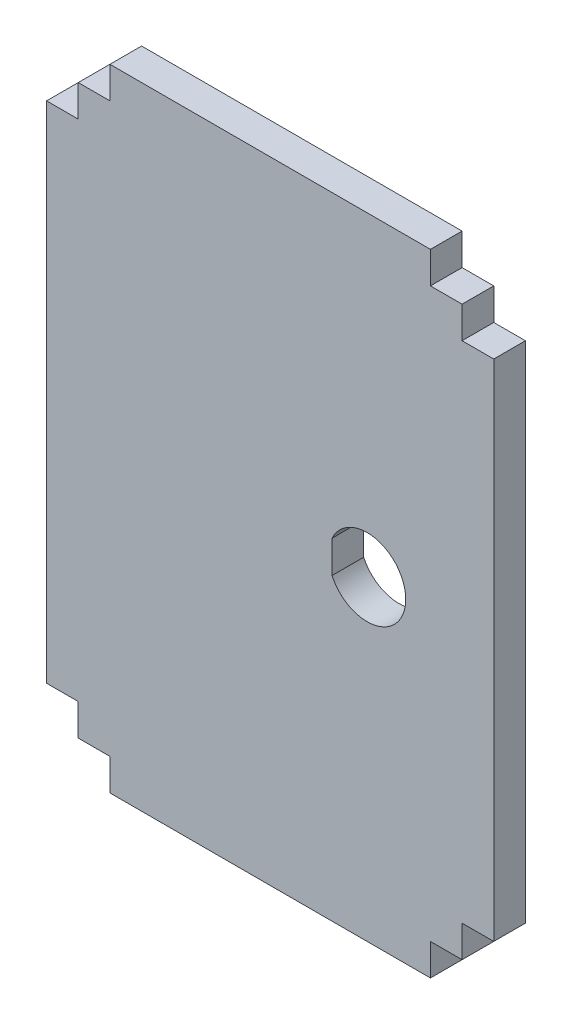
ISO-10303-21;
HEADER;
FILE_DESCRIPTION(('STEP AP214'),'2;1');
FILE_NAME('part.step','',(''),(''),'','','');
FILE_SCHEMA(('AUTOMOTIVE_DESIGN { 1 0 10303 214 1 1 1 1 }'));
ENDSEC;
DATA;
#1=APPLICATION_CONTEXT('core data for automotive mechanical design processes');
#2=APPLICATION_PROTOCOL_DEFINITION('international standard','automotive_design',2000,#1);
#3=PRODUCT_CONTEXT('',#1,'mechanical');
#4=PRODUCT('Part','Part','',(#3));
#5=PRODUCT_RELATED_PRODUCT_CATEGORY('part','',(#4));
#6=PRODUCT_DEFINITION_FORMATION('','',#4);
#7=PRODUCT_DEFINITION_CONTEXT('part definition',#1,'design');
#8=PRODUCT_DEFINITION('design','',#6,#7);
#9=PRODUCT_DEFINITION_SHAPE('','',#8);
#10=(LENGTH_UNIT() NAMED_UNIT(*) SI_UNIT(.MILLI.,.METRE.));
#11=(NAMED_UNIT(*) PLANE_ANGLE_UNIT() SI_UNIT($,.RADIAN.));
#12=(NAMED_UNIT(*) SI_UNIT($,.STERADIAN.) SOLID_ANGLE_UNIT());
#13=UNCERTAINTY_MEASURE_WITH_UNIT(LENGTH_MEASURE(1.E-05),#10,'distance_accuracy_value','');
#14=(GEOMETRIC_REPRESENTATION_CONTEXT(3) GLOBAL_UNCERTAINTY_ASSIGNED_CONTEXT((#13)) GLOBAL_UNIT_ASSIGNED_CONTEXT((#10,
#11,#12)) REPRESENTATION_CONTEXT('',''));
#15=CARTESIAN_POINT('',(0.,0.,0.));
#16=DIRECTION('',(0.,0.,1.));
#17=DIRECTION('',(1.,0.,0.));
#18=AXIS2_PLACEMENT_3D('',#15,#16,#17);
#19=CARTESIAN_POINT('',(-23.8832861119316,-35.1836502917989,-6.35));
#20=DIRECTION('',(-1.,0.,0.));
#21=DIRECTION('',(0.,-1.,0.));
#22=AXIS2_PLACEMENT_3D('',#19,#20,#21);
#23=PLANE('',#22);
#24=DIRECTION('',(0.,-1.,0.));
#25=VECTOR('',#24,1.);
#26=CARTESIAN_POINT('',(-23.8832861119316,-35.1836502917989,0.));
#27=LINE('',#26,#25);
#28=CARTESIAN_POINT('',(-23.8832861119316,-35.1836502917989,0.));
#29=VERTEX_POINT('',#28);
#30=CARTESIAN_POINT('',(-23.8832861119316,-41.5336502917989,0.));
#31=VERTEX_POINT('',#30);
#32=EDGE_CURVE('E198',#29,#31,#27,.T.);
#33=ORIENTED_EDGE('',*,*,#32,.F.);
#34=DIRECTION('',(0.,0.,1.));
#35=VECTOR('',#34,1.);
#36=CARTESIAN_POINT('',(-23.8832861119316,-35.1836502917989,-6.35));
#37=LINE('',#36,#35);
#38=CARTESIAN_POINT('',(-23.8832861119316,-35.1836502917989,-6.35));
#39=VERTEX_POINT('',#38);
#40=EDGE_CURVE('E11',#39,#29,#37,.T.);
#41=ORIENTED_EDGE('',*,*,#40,.F.);
#42=DIRECTION('',(0.,-1.,0.));
#43=VECTOR('',#42,1.);
#44=CARTESIAN_POINT('',(-23.8832861119316,-35.1836502917989,-6.35));
#45=LINE('',#44,#43);
#46=CARTESIAN_POINT('',(-23.8832861119316,-41.5336502917989,-6.35));
#47=VERTEX_POINT('',#46);
#48=EDGE_CURVE('E200',#39,#47,#45,.T.);
#49=ORIENTED_EDGE('',*,*,#48,.T.);
#50=DIRECTION('',(0.,0.,1.));
#51=VECTOR('',#50,1.);
#52=CARTESIAN_POINT('',(-23.8832861119316,-41.5336502917989,-6.35));
#53=LINE('',#52,#51);
#54=EDGE_CURVE('E36',#47,#31,#53,.T.);
#55=ORIENTED_EDGE('',*,*,#54,.T.);
#56=EDGE_LOOP('',(#33,#41,#49,#55));
#57=FACE_BOUND('',#56,.T.);
#58=ADVANCED_FACE('F33',(#57),#23,.T.);
#59=CARTESIAN_POINT('',(-30.2332861119316,-35.1836502917989,-6.35));
#60=DIRECTION('',(0.,-1.,0.));
#61=DIRECTION('',(0.,0.,-1.));
#62=AXIS2_PLACEMENT_3D('',#59,#60,#61);
#63=PLANE('',#62);
#64=DIRECTION('',(1.,0.,0.));
#65=VECTOR('',#64,1.);
#66=CARTESIAN_POINT('',(-30.2332861119316,-35.1836502917989,0.));
#67=LINE('',#66,#65);
#68=CARTESIAN_POINT('',(-30.2332861119316,-35.1836502917989,0.));
#69=VERTEX_POINT('',#68);
#70=EDGE_CURVE('E204',#69,#29,#67,.T.);
#71=ORIENTED_EDGE('',*,*,#70,.F.);
#72=DIRECTION('',(0.,0.,1.));
#73=VECTOR('',#72,1.);
#74=CARTESIAN_POINT('',(-30.2332861119316,-35.1836502917989,-6.35));
#75=LINE('',#74,#73);
#76=CARTESIAN_POINT('',(-30.2332861119316,-35.1836502917989,-6.35));
#77=VERTEX_POINT('',#76);
#78=EDGE_CURVE('E41',#77,#69,#75,.T.);
#79=ORIENTED_EDGE('',*,*,#78,.F.);
#80=DIRECTION('',(1.,0.,0.));
#81=VECTOR('',#80,1.);
#82=CARTESIAN_POINT('',(-30.2332861119316,-35.1836502917989,-6.35));
#83=LINE('',#82,#81);
#84=EDGE_CURVE('E258',#77,#39,#83,.T.);
#85=ORIENTED_EDGE('',*,*,#84,.T.);
#86=ORIENTED_EDGE('',*,*,#40,.T.);
#87=EDGE_LOOP('',(#71,#79,#85,#86));
#88=FACE_BOUND('',#87,.T.);
#89=ADVANCED_FACE('F363',(#88),#63,.T.);
#90=CARTESIAN_POINT('',(-30.2332861119316,-28.8336502917989,-6.35));
#91=DIRECTION('',(-1.,0.,0.));
#92=DIRECTION('',(0.,0.,1.));
#93=AXIS2_PLACEMENT_3D('',#90,#91,#92);
#94=PLANE('',#93);
#95=DIRECTION('',(0.,-1.,0.));
#96=VECTOR('',#95,1.);
#97=CARTESIAN_POINT('',(-30.2332861119316,-28.8336502917989,0.));
#98=LINE('',#97,#96);
#99=CARTESIAN_POINT('',(-30.2332861119316,-28.8336502917989,0.));
#100=VERTEX_POINT('',#99);
#101=EDGE_CURVE('E314',#100,#69,#98,.T.);
#102=ORIENTED_EDGE('',*,*,#101,.F.);
#103=DIRECTION('',(0.,0.,1.));
#104=VECTOR('',#103,1.);
#105=CARTESIAN_POINT('',(-30.2332861119316,-28.8336502917989,-6.35));
#106=LINE('',#105,#104);
#107=CARTESIAN_POINT('',(-30.2332861119316,-28.8336502917989,-6.35));
#108=VERTEX_POINT('',#107);
#109=EDGE_CURVE('E320',#108,#100,#106,.T.);
#110=ORIENTED_EDGE('',*,*,#109,.F.);
#111=DIRECTION('',(0.,-1.,0.));
#112=VECTOR('',#111,1.);
#113=CARTESIAN_POINT('',(-30.2332861119316,-28.8336502917989,-6.35));
#114=LINE('',#113,#112);
#115=EDGE_CURVE('E255',#108,#77,#114,.T.);
#116=ORIENTED_EDGE('',*,*,#115,.T.);
#117=ORIENTED_EDGE('',*,*,#78,.T.);
#118=EDGE_LOOP('',(#102,#110,#116,#117));
#119=FACE_BOUND('',#118,.T.);
#120=ADVANCED_FACE('F432',(#119),#94,.T.);
#121=CARTESIAN_POINT('',(-36.5832861119316,-28.8336502917989,-6.35));
#122=DIRECTION('',(0.,-1.,0.));
#123=DIRECTION('',(0.,0.,-1.));
#124=AXIS2_PLACEMENT_3D('',#121,#122,#123);
#125=PLANE('',#124);
#126=DIRECTION('',(1.,0.,0.));
#127=VECTOR('',#126,1.);
#128=CARTESIAN_POINT('',(-36.5832861119316,-28.8336502917989,0.));
#129=LINE('',#128,#127);
#130=CARTESIAN_POINT('',(-36.5832861119316,-28.8336502917989,0.));
#131=VERTEX_POINT('',#130);
#132=EDGE_CURVE('E311',#131,#100,#129,.T.);
#133=ORIENTED_EDGE('',*,*,#132,.F.);
#134=DIRECTION('',(0.,0.,1.));
#135=VECTOR('',#134,1.);
#136=CARTESIAN_POINT('',(-36.5832861119316,-28.8336502917989,-6.35));
#137=LINE('',#136,#135);
#138=CARTESIAN_POINT('',(-36.5832861119316,-28.8336502917989,-6.35));
#139=VERTEX_POINT('',#138);
#140=EDGE_CURVE('E322',#139,#131,#137,.T.);
#141=ORIENTED_EDGE('',*,*,#140,.F.);
#142=DIRECTION('',(1.,0.,0.));
#143=VECTOR('',#142,1.);
#144=CARTESIAN_POINT('',(-36.5832861119316,-28.8336502917989,-6.35));
#145=LINE('',#144,#143);
#146=EDGE_CURVE('E252',#139,#108,#145,.T.);
#147=ORIENTED_EDGE('',*,*,#146,.T.);
#148=ORIENTED_EDGE('',*,*,#109,.T.);
#149=EDGE_LOOP('',(#133,#141,#147,#148));
#150=FACE_BOUND('',#149,.T.);
#151=ADVANCED_FACE('F430',(#150),#125,.T.);
#152=CARTESIAN_POINT('',(-36.5832861119316,72.3345497082011,-6.35));
#153=DIRECTION('',(-1.,0.,0.));
#154=DIRECTION('',(0.,0.,1.));
#155=AXIS2_PLACEMENT_3D('',#152,#153,#154);
#156=PLANE('',#155);
#157=DIRECTION('',(0.,-1.,0.));
#158=VECTOR('',#157,1.);
#159=CARTESIAN_POINT('',(-36.5832861119316,72.3345497082011,0.));
#160=LINE('',#159,#158);
#161=CARTESIAN_POINT('',(-36.5832861119316,72.3345497082011,0.));
#162=VERTEX_POINT('',#161);
#163=EDGE_CURVE('E308',#162,#131,#160,.T.);
#164=ORIENTED_EDGE('',*,*,#163,.F.);
#165=DIRECTION('',(0.,0.,1.));
#166=VECTOR('',#165,1.);
#167=CARTESIAN_POINT('',(-36.5832861119316,72.3345497082011,-6.35));
#168=LINE('',#167,#166);
#169=CARTESIAN_POINT('',(-36.5832861119316,72.3345497082011,-6.35));
#170=VERTEX_POINT('',#169);
#171=EDGE_CURVE('E324',#170,#162,#168,.T.);
#172=ORIENTED_EDGE('',*,*,#171,.F.);
#173=DIRECTION('',(0.,-1.,0.));
#174=VECTOR('',#173,1.);
#175=CARTESIAN_POINT('',(-36.5832861119316,72.3345497082011,-6.35));
#176=LINE('',#175,#174);
#177=EDGE_CURVE('E249',#170,#139,#176,.T.);
#178=ORIENTED_EDGE('',*,*,#177,.T.);
#179=ORIENTED_EDGE('',*,*,#140,.T.);
#180=EDGE_LOOP('',(#164,#172,#178,#179));
#181=FACE_BOUND('',#180,.T.);
#182=ADVANCED_FACE('F426',(#181),#156,.T.);
#183=CARTESIAN_POINT('',(-30.2332861119316,72.3345497082011,-6.35));
#184=DIRECTION('',(0.,1.,0.));
#185=DIRECTION('',(0.,0.,1.));
#186=AXIS2_PLACEMENT_3D('',#183,#184,#185);
#187=PLANE('',#186);
#188=DIRECTION('',(-1.,0.,0.));
#189=VECTOR('',#188,1.);
#190=CARTESIAN_POINT('',(-30.2332861119316,72.3345497082011,0.));
#191=LINE('',#190,#189);
#192=CARTESIAN_POINT('',(-30.2332861119316,72.3345497082011,0.));
#193=VERTEX_POINT('',#192);
#194=EDGE_CURVE('E305',#193,#162,#191,.T.);
#195=ORIENTED_EDGE('',*,*,#194,.F.);
#196=DIRECTION('',(0.,0.,1.));
#197=VECTOR('',#196,1.);
#198=CARTESIAN_POINT('',(-30.2332861119316,72.3345497082011,-6.35));
#199=LINE('',#198,#197);
#200=CARTESIAN_POINT('',(-30.2332861119316,72.3345497082011,-6.35));
#201=VERTEX_POINT('',#200);
#202=EDGE_CURVE('E326',#201,#193,#199,.T.);
#203=ORIENTED_EDGE('',*,*,#202,.F.);
#204=DIRECTION('',(-1.,0.,0.));
#205=VECTOR('',#204,1.);
#206=CARTESIAN_POINT('',(-30.2332861119316,72.3345497082011,-6.35));
#207=LINE('',#206,#205);
#208=EDGE_CURVE('E246',#201,#170,#207,.T.);
#209=ORIENTED_EDGE('',*,*,#208,.T.);
#210=ORIENTED_EDGE('',*,*,#171,.T.);
#211=EDGE_LOOP('',(#195,#203,#209,#210));
#212=FACE_BOUND('',#211,.T.);
#213=ADVANCED_FACE('F422',(#212),#187,.T.);
#214=CARTESIAN_POINT('',(-30.2332861119316,78.6845497082011,-6.35));
#215=DIRECTION('',(-1.,0.,0.));
#216=DIRECTION('',(0.,0.,1.));
#217=AXIS2_PLACEMENT_3D('',#214,#215,#216);
#218=PLANE('',#217);
#219=DIRECTION('',(0.,-1.,0.));
#220=VECTOR('',#219,1.);
#221=CARTESIAN_POINT('',(-30.2332861119316,78.6845497082011,0.));
#222=LINE('',#221,#220);
#223=CARTESIAN_POINT('',(-30.2332861119316,78.6845497082011,0.));
#224=VERTEX_POINT('',#223);
#225=EDGE_CURVE('E302',#224,#193,#222,.T.);
#226=ORIENTED_EDGE('',*,*,#225,.F.);
#227=DIRECTION('',(0.,0.,1.));
#228=VECTOR('',#227,1.);
#229=CARTESIAN_POINT('',(-30.2332861119316,78.6845497082011,-6.35));
#230=LINE('',#229,#228);
#231=CARTESIAN_POINT('',(-30.2332861119316,78.6845497082011,-6.35));
#232=VERTEX_POINT('',#231);
#233=EDGE_CURVE('E328',#232,#224,#230,.T.);
#234=ORIENTED_EDGE('',*,*,#233,.F.);
#235=DIRECTION('',(0.,-1.,0.));
#236=VECTOR('',#235,1.);
#237=CARTESIAN_POINT('',(-30.2332861119316,78.6845497082011,-6.35));
#238=LINE('',#237,#236);
#239=EDGE_CURVE('E243',#232,#201,#238,.T.);
#240=ORIENTED_EDGE('',*,*,#239,.T.);
#241=ORIENTED_EDGE('',*,*,#202,.T.);
#242=EDGE_LOOP('',(#226,#234,#240,#241));
#243=FACE_BOUND('',#242,.T.);
#244=ADVANCED_FACE('F418',(#243),#218,.T.);
#245=CARTESIAN_POINT('',(-23.8832861119316,78.6845497082011,-6.35));
#246=DIRECTION('',(0.,1.,0.));
#247=DIRECTION('',(-1.,0.,0.));
#248=AXIS2_PLACEMENT_3D('',#245,#246,#247);
#249=PLANE('',#248);
#250=DIRECTION('',(-1.,0.,0.));
#251=VECTOR('',#250,1.);
#252=CARTESIAN_POINT('',(-23.8832861119316,78.6845497082011,0.));
#253=LINE('',#252,#251);
#254=CARTESIAN_POINT('',(-23.8832861119316,78.6845497082011,0.));
#255=VERTEX_POINT('',#254);
#256=EDGE_CURVE('E299',#255,#224,#253,.T.);
#257=ORIENTED_EDGE('',*,*,#256,.F.);
#258=DIRECTION('',(0.,0.,1.));
#259=VECTOR('',#258,1.);
#260=CARTESIAN_POINT('',(-23.8832861119316,78.6845497082011,-6.35));
#261=LINE('',#260,#259);
#262=CARTESIAN_POINT('',(-23.8832861119316,78.6845497082011,-6.35));
#263=VERTEX_POINT('',#262);
#264=EDGE_CURVE('E330',#263,#255,#261,.T.);
#265=ORIENTED_EDGE('',*,*,#264,.F.);
#266=DIRECTION('',(-1.,0.,0.));
#267=VECTOR('',#266,1.);
#268=CARTESIAN_POINT('',(-23.8832861119316,78.6845497082011,-6.35));
#269=LINE('',#268,#267);
#270=EDGE_CURVE('E240',#263,#232,#269,.T.);
#271=ORIENTED_EDGE('',*,*,#270,.T.);
#272=ORIENTED_EDGE('',*,*,#233,.T.);
#273=EDGE_LOOP('',(#257,#265,#271,#272));
#274=FACE_BOUND('',#273,.T.);
#275=ADVANCED_FACE('F414',(#274),#249,.T.);
#276=CARTESIAN_POINT('',(-23.8832861119316,85.0345497082011,-6.35));
#277=DIRECTION('',(-1.,0.,0.));
#278=DIRECTION('',(0.,-1.,0.));
#279=AXIS2_PLACEMENT_3D('',#276,#277,#278);
#280=PLANE('',#279);
#281=DIRECTION('',(0.,-1.,0.));
#282=VECTOR('',#281,1.);
#283=CARTESIAN_POINT('',(-23.8832861119316,85.0345497082011,0.));
#284=LINE('',#283,#282);
#285=CARTESIAN_POINT('',(-23.8832861119316,85.0345497082011,0.));
#286=VERTEX_POINT('',#285);
#287=EDGE_CURVE('E296',#286,#255,#284,.T.);
#288=ORIENTED_EDGE('',*,*,#287,.F.);
#289=DIRECTION('',(0.,0.,1.));
#290=VECTOR('',#289,1.);
#291=CARTESIAN_POINT('',(-23.8832861119316,85.0345497082011,-6.35));
#292=LINE('',#291,#290);
#293=CARTESIAN_POINT('',(-23.8832861119316,85.0345497082011,-6.35));
#294=VERTEX_POINT('',#293);
#295=EDGE_CURVE('E332',#294,#286,#292,.T.);
#296=ORIENTED_EDGE('',*,*,#295,.F.);
#297=DIRECTION('',(0.,-1.,0.));
#298=VECTOR('',#297,1.);
#299=CARTESIAN_POINT('',(-23.8832861119316,85.0345497082011,-6.35));
#300=LINE('',#299,#298);
#301=EDGE_CURVE('E237',#294,#263,#300,.T.);
#302=ORIENTED_EDGE('',*,*,#301,.T.);
#303=ORIENTED_EDGE('',*,*,#264,.T.);
#304=EDGE_LOOP('',(#288,#296,#302,#303));
#305=FACE_BOUND('',#304,.T.);
#306=ADVANCED_FACE('F410',(#305),#280,.T.);
#307=CARTESIAN_POINT('',(40.4041138880684,85.0345497082011,-6.35));
#308=DIRECTION('',(0.,1.,0.));
#309=DIRECTION('',(-1.,0.,0.));
#310=AXIS2_PLACEMENT_3D('',#307,#308,#309);
#311=PLANE('',#310);
#312=DIRECTION('',(-1.,0.,0.));
#313=VECTOR('',#312,1.);
#314=CARTESIAN_POINT('',(40.4041138880684,85.0345497082011,0.));
#315=LINE('',#314,#313);
#316=CARTESIAN_POINT('',(40.4041138880684,85.0345497082011,0.));
#317=VERTEX_POINT('',#316);
#318=EDGE_CURVE('E293',#317,#286,#315,.T.);
#319=ORIENTED_EDGE('',*,*,#318,.F.);
#320=DIRECTION('',(0.,0.,1.));
#321=VECTOR('',#320,1.);
#322=CARTESIAN_POINT('',(40.4041138880684,85.0345497082011,-6.35));
#323=LINE('',#322,#321);
#324=CARTESIAN_POINT('',(40.4041138880684,85.0345497082011,-6.35));
#325=VERTEX_POINT('',#324);
#326=EDGE_CURVE('E334',#325,#317,#323,.T.);
#327=ORIENTED_EDGE('',*,*,#326,.F.);
#328=DIRECTION('',(-1.,0.,0.));
#329=VECTOR('',#328,1.);
#330=CARTESIAN_POINT('',(40.4041138880684,85.0345497082011,-6.35));
#331=LINE('',#330,#329);
#332=EDGE_CURVE('E234',#325,#294,#331,.T.);
#333=ORIENTED_EDGE('',*,*,#332,.T.);
#334=ORIENTED_EDGE('',*,*,#295,.T.);
#335=EDGE_LOOP('',(#319,#327,#333,#334));
#336=FACE_BOUND('',#335,.T.);
#337=ADVANCED_FACE('F406',(#336),#311,.T.);
#338=CARTESIAN_POINT('',(40.4041138880684,78.6845497082011,-6.35));
#339=DIRECTION('',(1.,0.,0.));
#340=DIRECTION('',(0.,0.,-1.));
#341=AXIS2_PLACEMENT_3D('',#338,#339,#340);
#342=PLANE('',#341);
#343=DIRECTION('',(0.,1.,0.));
#344=VECTOR('',#343,1.);
#345=CARTESIAN_POINT('',(40.4041138880684,78.6845497082011,0.));
#346=LINE('',#345,#344);
#347=CARTESIAN_POINT('',(40.4041138880684,78.6845497082011,0.));
#348=VERTEX_POINT('',#347);
#349=EDGE_CURVE('E290',#348,#317,#346,.T.);
#350=ORIENTED_EDGE('',*,*,#349,.F.);
#351=DIRECTION('',(0.,0.,1.));
#352=VECTOR('',#351,1.);
#353=CARTESIAN_POINT('',(40.4041138880684,78.6845497082011,-6.35));
#354=LINE('',#353,#352);
#355=CARTESIAN_POINT('',(40.4041138880684,78.6845497082011,-6.35));
#356=VERTEX_POINT('',#355);
#357=EDGE_CURVE('E336',#356,#348,#354,.T.);
#358=ORIENTED_EDGE('',*,*,#357,.F.);
#359=DIRECTION('',(0.,1.,0.));
#360=VECTOR('',#359,1.);
#361=CARTESIAN_POINT('',(40.4041138880684,78.6845497082011,-6.35));
#362=LINE('',#361,#360);
#363=EDGE_CURVE('E231',#356,#325,#362,.T.);
#364=ORIENTED_EDGE('',*,*,#363,.T.);
#365=ORIENTED_EDGE('',*,*,#326,.T.);
#366=EDGE_LOOP('',(#350,#358,#364,#365));
#367=FACE_BOUND('',#366,.T.);
#368=ADVANCED_FACE('F402',(#367),#342,.T.);
#369=CARTESIAN_POINT('',(46.7541138880684,78.6845497082011,-6.35));
#370=DIRECTION('',(0.,1.,0.));
#371=DIRECTION('',(0.,0.,1.));
#372=AXIS2_PLACEMENT_3D('',#369,#370,#371);
#373=PLANE('',#372);
#374=DIRECTION('',(-1.,0.,0.));
#375=VECTOR('',#374,1.);
#376=CARTESIAN_POINT('',(46.7541138880684,78.6845497082011,0.));
#377=LINE('',#376,#375);
#378=CARTESIAN_POINT('',(46.7541138880684,78.6845497082011,0.));
#379=VERTEX_POINT('',#378);
#380=EDGE_CURVE('E287',#379,#348,#377,.T.);
#381=ORIENTED_EDGE('',*,*,#380,.F.);
#382=DIRECTION('',(0.,0.,1.));
#383=VECTOR('',#382,1.);
#384=CARTESIAN_POINT('',(46.7541138880684,78.6845497082011,-6.35));
#385=LINE('',#384,#383);
#386=CARTESIAN_POINT('',(46.7541138880684,78.6845497082011,-6.35));
#387=VERTEX_POINT('',#386);
#388=EDGE_CURVE('E338',#387,#379,#385,.T.);
#389=ORIENTED_EDGE('',*,*,#388,.F.);
#390=DIRECTION('',(-1.,0.,0.));
#391=VECTOR('',#390,1.);
#392=CARTESIAN_POINT('',(46.7541138880684,78.6845497082011,-6.35));
#393=LINE('',#392,#391);
#394=EDGE_CURVE('E228',#387,#356,#393,.T.);
#395=ORIENTED_EDGE('',*,*,#394,.T.);
#396=ORIENTED_EDGE('',*,*,#357,.T.);
#397=EDGE_LOOP('',(#381,#389,#395,#396));
#398=FACE_BOUND('',#397,.T.);
#399=ADVANCED_FACE('F398',(#398),#373,.T.);
#400=CARTESIAN_POINT('',(46.7541138880684,72.3345497082011,-6.35));
#401=DIRECTION('',(1.,0.,0.));
#402=DIRECTION('',(0.,0.,-1.));
#403=AXIS2_PLACEMENT_3D('',#400,#401,#402);
#404=PLANE('',#403);
#405=DIRECTION('',(0.,1.,0.));
#406=VECTOR('',#405,1.);
#407=CARTESIAN_POINT('',(46.7541138880684,72.3345497082011,0.));
#408=LINE('',#407,#406);
#409=CARTESIAN_POINT('',(46.7541138880684,72.3345497082011,0.));
#410=VERTEX_POINT('',#409);
#411=EDGE_CURVE('E284',#410,#379,#408,.T.);
#412=ORIENTED_EDGE('',*,*,#411,.F.);
#413=DIRECTION('',(0.,0.,1.));
#414=VECTOR('',#413,1.);
#415=CARTESIAN_POINT('',(46.7541138880684,72.3345497082011,-6.35));
#416=LINE('',#415,#414);
#417=CARTESIAN_POINT('',(46.7541138880684,72.3345497082011,-6.35));
#418=VERTEX_POINT('',#417);
#419=EDGE_CURVE('E340',#418,#410,#416,.T.);
#420=ORIENTED_EDGE('',*,*,#419,.F.);
#421=DIRECTION('',(0.,1.,0.));
#422=VECTOR('',#421,1.);
#423=CARTESIAN_POINT('',(46.7541138880684,72.3345497082011,-6.35));
#424=LINE('',#423,#422);
#425=EDGE_CURVE('E225',#418,#387,#424,.T.);
#426=ORIENTED_EDGE('',*,*,#425,.T.);
#427=ORIENTED_EDGE('',*,*,#388,.T.);
#428=EDGE_LOOP('',(#412,#420,#426,#427));
#429=FACE_BOUND('',#428,.T.);
#430=ADVANCED_FACE('F394',(#429),#404,.T.);
#431=CARTESIAN_POINT('',(53.1041138880684,72.3345497082011,-6.35));
#432=DIRECTION('',(0.,1.,0.));
#433=DIRECTION('',(-1.,0.,0.));
#434=AXIS2_PLACEMENT_3D('',#431,#432,#433);
#435=PLANE('',#434);
#436=DIRECTION('',(-1.,0.,0.));
#437=VECTOR('',#436,1.);
#438=CARTESIAN_POINT('',(53.1041138880684,72.3345497082011,0.));
#439=LINE('',#438,#437);
#440=CARTESIAN_POINT('',(53.1041138880684,72.3345497082011,0.));
#441=VERTEX_POINT('',#440);
#442=EDGE_CURVE('E281',#441,#410,#439,.T.);
#443=ORIENTED_EDGE('',*,*,#442,.F.);
#444=DIRECTION('',(0.,0.,1.));
#445=VECTOR('',#444,1.);
#446=CARTESIAN_POINT('',(53.1041138880684,72.3345497082011,-6.35));
#447=LINE('',#446,#445);
#448=CARTESIAN_POINT('',(53.1041138880684,72.3345497082011,-6.35));
#449=VERTEX_POINT('',#448);
#450=EDGE_CURVE('E342',#449,#441,#447,.T.);
#451=ORIENTED_EDGE('',*,*,#450,.F.);
#452=DIRECTION('',(-1.,0.,0.));
#453=VECTOR('',#452,1.);
#454=CARTESIAN_POINT('',(53.1041138880684,72.3345497082011,-6.35));
#455=LINE('',#454,#453);
#456=EDGE_CURVE('E222',#449,#418,#455,.T.);
#457=ORIENTED_EDGE('',*,*,#456,.T.);
#458=ORIENTED_EDGE('',*,*,#419,.T.);
#459=EDGE_LOOP('',(#443,#451,#457,#458));
#460=FACE_BOUND('',#459,.T.);
#461=ADVANCED_FACE('F390',(#460),#435,.T.);
#462=CARTESIAN_POINT('',(53.1041138880684,-28.8336502917988,-6.35));
#463=DIRECTION('',(1.,0.,0.));
#464=DIRECTION('',(0.,0.,-1.));
#465=AXIS2_PLACEMENT_3D('',#462,#463,#464);
#466=PLANE('',#465);
#467=DIRECTION('',(0.,1.,0.));
#468=VECTOR('',#467,1.);
#469=CARTESIAN_POINT('',(53.1041138880684,-28.8336502917988,0.));
#470=LINE('',#469,#468);
#471=CARTESIAN_POINT('',(53.1041138880684,-28.8336502917988,0.));
#472=VERTEX_POINT('',#471);
#473=EDGE_CURVE('E278',#472,#441,#470,.T.);
#474=ORIENTED_EDGE('',*,*,#473,.F.);
#475=DIRECTION('',(0.,0.,1.));
#476=VECTOR('',#475,1.);
#477=CARTESIAN_POINT('',(53.1041138880684,-28.8336502917988,-6.35));
#478=LINE('',#477,#476);
#479=CARTESIAN_POINT('',(53.1041138880684,-28.8336502917988,-6.35));
#480=VERTEX_POINT('',#479);
#481=EDGE_CURVE('E344',#480,#472,#478,.T.);
#482=ORIENTED_EDGE('',*,*,#481,.F.);
#483=DIRECTION('',(0.,1.,0.));
#484=VECTOR('',#483,1.);
#485=CARTESIAN_POINT('',(53.1041138880684,-28.8336502917988,-6.35));
#486=LINE('',#485,#484);
#487=EDGE_CURVE('E219',#480,#449,#486,.T.);
#488=ORIENTED_EDGE('',*,*,#487,.T.);
#489=ORIENTED_EDGE('',*,*,#450,.T.);
#490=EDGE_LOOP('',(#474,#482,#488,#489));
#491=FACE_BOUND('',#490,.T.);
#492=ADVANCED_FACE('F386',(#491),#466,.T.);
#493=CARTESIAN_POINT('',(46.7541138880684,-28.8336502917988,-6.35));
#494=DIRECTION('',(0.,-1.,0.));
#495=DIRECTION('',(1.,0.,0.));
#496=AXIS2_PLACEMENT_3D('',#493,#494,#495);
#497=PLANE('',#496);
#498=DIRECTION('',(1.,0.,0.));
#499=VECTOR('',#498,1.);
#500=CARTESIAN_POINT('',(46.7541138880684,-28.8336502917988,0.));
#501=LINE('',#500,#499);
#502=CARTESIAN_POINT('',(46.7541138880684,-28.8336502917988,0.));
#503=VERTEX_POINT('',#502);
#504=EDGE_CURVE('E275',#503,#472,#501,.T.);
#505=ORIENTED_EDGE('',*,*,#504,.F.);
#506=DIRECTION('',(0.,0.,1.));
#507=VECTOR('',#506,1.);
#508=CARTESIAN_POINT('',(46.7541138880684,-28.8336502917988,-6.35));
#509=LINE('',#508,#507);
#510=CARTESIAN_POINT('',(46.7541138880684,-28.8336502917988,-6.35));
#511=VERTEX_POINT('',#510);
#512=EDGE_CURVE('E346',#511,#503,#509,.T.);
#513=ORIENTED_EDGE('',*,*,#512,.F.);
#514=DIRECTION('',(1.,0.,0.));
#515=VECTOR('',#514,1.);
#516=CARTESIAN_POINT('',(46.7541138880684,-28.8336502917988,-6.35));
#517=LINE('',#516,#515);
#518=EDGE_CURVE('E216',#511,#480,#517,.T.);
#519=ORIENTED_EDGE('',*,*,#518,.T.);
#520=ORIENTED_EDGE('',*,*,#481,.T.);
#521=EDGE_LOOP('',(#505,#513,#519,#520));
#522=FACE_BOUND('',#521,.T.);
#523=ADVANCED_FACE('F382',(#522),#497,.T.);
#524=CARTESIAN_POINT('',(46.7541138880684,-35.1836502917989,-6.35));
#525=DIRECTION('',(1.,0.,0.));
#526=DIRECTION('',(0.,0.,-1.));
#527=AXIS2_PLACEMENT_3D('',#524,#525,#526);
#528=PLANE('',#527);
#529=DIRECTION('',(0.,1.,0.));
#530=VECTOR('',#529,1.);
#531=CARTESIAN_POINT('',(46.7541138880684,-35.1836502917989,0.));
#532=LINE('',#531,#530);
#533=CARTESIAN_POINT('',(46.7541138880684,-35.1836502917989,0.));
#534=VERTEX_POINT('',#533);
#535=EDGE_CURVE('E272',#534,#503,#532,.T.);
#536=ORIENTED_EDGE('',*,*,#535,.F.);
#537=DIRECTION('',(0.,0.,1.));
#538=VECTOR('',#537,1.);
#539=CARTESIAN_POINT('',(46.7541138880684,-35.1836502917989,-6.35));
#540=LINE('',#539,#538);
#541=CARTESIAN_POINT('',(46.7541138880684,-35.1836502917989,-6.35));
#542=VERTEX_POINT('',#541);
#543=EDGE_CURVE('E348',#542,#534,#540,.T.);
#544=ORIENTED_EDGE('',*,*,#543,.F.);
#545=DIRECTION('',(0.,1.,0.));
#546=VECTOR('',#545,1.);
#547=CARTESIAN_POINT('',(46.7541138880684,-35.1836502917989,-6.35));
#548=LINE('',#547,#546);
#549=EDGE_CURVE('E213',#542,#511,#548,.T.);
#550=ORIENTED_EDGE('',*,*,#549,.T.);
#551=ORIENTED_EDGE('',*,*,#512,.T.);
#552=EDGE_LOOP('',(#536,#544,#550,#551));
#553=FACE_BOUND('',#552,.T.);
#554=ADVANCED_FACE('F378',(#553),#528,.T.);
#555=CARTESIAN_POINT('',(40.4041138880684,-35.1836502917989,-6.35));
#556=DIRECTION('',(0.,-1.,0.));
#557=DIRECTION('',(0.,0.,-1.));
#558=AXIS2_PLACEMENT_3D('',#555,#556,#557);
#559=PLANE('',#558);
#560=DIRECTION('',(1.,0.,0.));
#561=VECTOR('',#560,1.);
#562=CARTESIAN_POINT('',(40.4041138880684,-35.1836502917989,0.));
#563=LINE('',#562,#561);
#564=CARTESIAN_POINT('',(40.4041138880684,-35.1836502917989,0.));
#565=VERTEX_POINT('',#564);
#566=EDGE_CURVE('E269',#565,#534,#563,.T.);
#567=ORIENTED_EDGE('',*,*,#566,.F.);
#568=DIRECTION('',(0.,0.,1.));
#569=VECTOR('',#568,1.);
#570=CARTESIAN_POINT('',(40.4041138880684,-35.1836502917989,-6.35));
#571=LINE('',#570,#569);
#572=CARTESIAN_POINT('',(40.4041138880684,-35.1836502917989,-6.35));
#573=VERTEX_POINT('',#572);
#574=EDGE_CURVE('E350',#573,#565,#571,.T.);
#575=ORIENTED_EDGE('',*,*,#574,.F.);
#576=DIRECTION('',(1.,0.,0.));
#577=VECTOR('',#576,1.);
#578=CARTESIAN_POINT('',(40.4041138880684,-35.1836502917989,-6.35));
#579=LINE('',#578,#577);
#580=EDGE_CURVE('E210',#573,#542,#579,.T.);
#581=ORIENTED_EDGE('',*,*,#580,.T.);
#582=ORIENTED_EDGE('',*,*,#543,.T.);
#583=EDGE_LOOP('',(#567,#575,#581,#582));
#584=FACE_BOUND('',#583,.T.);
#585=ADVANCED_FACE('F376',(#584),#559,.T.);
#586=CARTESIAN_POINT('',(40.4041138880684,-41.5336502917989,-6.35));
#587=DIRECTION('',(1.,0.,0.));
#588=DIRECTION('',(0.,0.,-1.));
#589=AXIS2_PLACEMENT_3D('',#586,#587,#588);
#590=PLANE('',#589);
#591=DIRECTION('',(0.,1.,0.));
#592=VECTOR('',#591,1.);
#593=CARTESIAN_POINT('',(40.4041138880684,-41.5336502917989,0.));
#594=LINE('',#593,#592);
#595=CARTESIAN_POINT('',(40.4041138880684,-41.5336502917989,0.));
#596=VERTEX_POINT('',#595);
#597=EDGE_CURVE('E266',#596,#565,#594,.T.);
#598=ORIENTED_EDGE('',*,*,#597,.F.);
#599=DIRECTION('',(0.,0.,1.));
#600=VECTOR('',#599,1.);
#601=CARTESIAN_POINT('',(40.4041138880684,-41.5336502917989,-6.35));
#602=LINE('',#601,#600);
#603=CARTESIAN_POINT('',(40.4041138880684,-41.5336502917989,-6.35));
#604=VERTEX_POINT('',#603);
#605=EDGE_CURVE('E351',#604,#596,#602,.T.);
#606=ORIENTED_EDGE('',*,*,#605,.F.);
#607=DIRECTION('',(0.,1.,0.));
#608=VECTOR('',#607,1.);
#609=CARTESIAN_POINT('',(40.4041138880684,-41.5336502917989,-6.35));
#610=LINE('',#609,#608);
#611=EDGE_CURVE('E207',#604,#573,#610,.T.);
#612=ORIENTED_EDGE('',*,*,#611,.T.);
#613=ORIENTED_EDGE('',*,*,#574,.T.);
#614=EDGE_LOOP('',(#598,#606,#612,#613));
#615=FACE_BOUND('',#614,.T.);
#616=ADVANCED_FACE('F372',(#615),#590,.T.);
#617=CARTESIAN_POINT('',(-23.8832861119316,-41.5336502917989,-6.35));
#618=DIRECTION('',(0.,-1.,0.));
#619=DIRECTION('',(1.,0.,0.));
#620=AXIS2_PLACEMENT_3D('',#617,#618,#619);
#621=PLANE('',#620);
#622=DIRECTION('',(1.,0.,0.));
#623=VECTOR('',#622,1.);
#624=CARTESIAN_POINT('',(-23.8832861119316,-41.5336502917989,0.));
#625=LINE('',#624,#623);
#626=EDGE_CURVE('E263',#31,#596,#625,.T.);
#627=ORIENTED_EDGE('',*,*,#626,.F.);
#628=ORIENTED_EDGE('',*,*,#54,.F.);
#629=DIRECTION('',(1.,0.,0.));
#630=VECTOR('',#629,1.);
#631=CARTESIAN_POINT('',(-23.8832861119316,-41.5336502917989,-6.35));
#632=LINE('',#631,#630);
#633=EDGE_CURVE('E203',#47,#604,#632,.T.);
#634=ORIENTED_EDGE('',*,*,#633,.T.);
#635=ORIENTED_EDGE('',*,*,#605,.T.);
#636=EDGE_LOOP('',(#627,#628,#634,#635));
#637=FACE_BOUND('',#636,.T.);
#638=ADVANCED_FACE('F359',(#637),#621,.T.);
#639=CARTESIAN_POINT('',(0.,0.,-6.35));
#640=DIRECTION('',(0.,0.,1.));
#641=DIRECTION('',(1.,0.,0.));
#642=AXIS2_PLACEMENT_3D('',#639,#640,#641);
#643=PLANE('',#642);
#644=DIRECTION('',(0.,1.,0.));
#645=VECTOR('',#644,1.);
#646=CARTESIAN_POINT('',(20.6683138625752,24.9929066472011,-6.35));
#647=LINE('',#646,#645);
#648=CARTESIAN_POINT('',(20.6683138625752,18.5079927692011,-6.35));
#649=VERTEX_POINT('',#648);
#650=CARTESIAN_POINT('',(20.6683138625752,24.9929066472011,-6.35));
#651=VERTEX_POINT('',#650);
#652=EDGE_CURVE('E193',#649,#651,#647,.T.);
#653=ORIENTED_EDGE('',*,*,#652,.F.);
#654=CARTESIAN_POINT('',(27.7041138880684,21.7504497082011,-6.35));
#655=DIRECTION('',(0.,0.,-1.));
#656=DIRECTION('',(-1.,0.,0.));
#657=AXIS2_PLACEMENT_3D('',#654,#655,#656);
#658=CIRCLE('',#657,7.747);
#659=EDGE_CURVE('E49',#651,#649,#658,.T.);
#660=ORIENTED_EDGE('',*,*,#659,.F.);
#661=EDGE_LOOP('',(#653,#660));
#662=FACE_BOUND('',#661,.T.);
#663=ORIENTED_EDGE('',*,*,#48,.F.);
#664=ORIENTED_EDGE('',*,*,#84,.F.);
#665=ORIENTED_EDGE('',*,*,#115,.F.);
#666=ORIENTED_EDGE('',*,*,#146,.F.);
#667=ORIENTED_EDGE('',*,*,#177,.F.);
#668=ORIENTED_EDGE('',*,*,#208,.F.);
#669=ORIENTED_EDGE('',*,*,#239,.F.);
#670=ORIENTED_EDGE('',*,*,#270,.F.);
#671=ORIENTED_EDGE('',*,*,#301,.F.);
#672=ORIENTED_EDGE('',*,*,#332,.F.);
#673=ORIENTED_EDGE('',*,*,#363,.F.);
#674=ORIENTED_EDGE('',*,*,#394,.F.);
#675=ORIENTED_EDGE('',*,*,#425,.F.);
#676=ORIENTED_EDGE('',*,*,#456,.F.);
#677=ORIENTED_EDGE('',*,*,#487,.F.);
#678=ORIENTED_EDGE('',*,*,#518,.F.);
#679=ORIENTED_EDGE('',*,*,#549,.F.);
#680=ORIENTED_EDGE('',*,*,#580,.F.);
#681=ORIENTED_EDGE('',*,*,#611,.F.);
#682=ORIENTED_EDGE('',*,*,#633,.F.);
#683=EDGE_LOOP('',(#663,#664,#665,#666,#667,#668,#669,#670,#671,#672,#673,#674,#675,#676,#677,
#678,#679,#680,#681,#682));
#684=FACE_BOUND('',#683,.T.);
#685=ADVANCED_FACE('F366',(#662,#684),#643,.F.);
#686=CARTESIAN_POINT('',(0.,0.,0.));
#687=DIRECTION('',(0.,0.,1.));
#688=DIRECTION('',(1.,0.,0.));
#689=AXIS2_PLACEMENT_3D('',#686,#687,#688);
#690=PLANE('',#689);
#691=CARTESIAN_POINT('',(27.7041138880684,21.7504497082011,0.));
#692=DIRECTION('',(0.,0.,-1.));
#693=DIRECTION('',(-1.,0.,0.));
#694=AXIS2_PLACEMENT_3D('',#691,#692,#693);
#695=CIRCLE('',#694,7.747);
#696=CARTESIAN_POINT('',(20.6683138625752,24.9929066472011,0.));
#697=VERTEX_POINT('',#696);
#698=CARTESIAN_POINT('',(20.6683138625752,18.5079927692011,0.));
#699=VERTEX_POINT('',#698);
#700=EDGE_CURVE('E54',#697,#699,#695,.T.);
#701=ORIENTED_EDGE('',*,*,#700,.T.);
#702=DIRECTION('',(0.,1.,0.));
#703=VECTOR('',#702,1.);
#704=CARTESIAN_POINT('',(20.6683138625752,24.9929066472011,0.));
#705=LINE('',#704,#703);
#706=EDGE_CURVE('E185',#699,#697,#705,.T.);
#707=ORIENTED_EDGE('',*,*,#706,.T.);
#708=EDGE_LOOP('',(#701,#707));
#709=FACE_BOUND('',#708,.T.);
#710=ORIENTED_EDGE('',*,*,#32,.T.);
#711=ORIENTED_EDGE('',*,*,#626,.T.);
#712=ORIENTED_EDGE('',*,*,#597,.T.);
#713=ORIENTED_EDGE('',*,*,#566,.T.);
#714=ORIENTED_EDGE('',*,*,#535,.T.);
#715=ORIENTED_EDGE('',*,*,#504,.T.);
#716=ORIENTED_EDGE('',*,*,#473,.T.);
#717=ORIENTED_EDGE('',*,*,#442,.T.);
#718=ORIENTED_EDGE('',*,*,#411,.T.);
#719=ORIENTED_EDGE('',*,*,#380,.T.);
#720=ORIENTED_EDGE('',*,*,#349,.T.);
#721=ORIENTED_EDGE('',*,*,#318,.T.);
#722=ORIENTED_EDGE('',*,*,#287,.T.);
#723=ORIENTED_EDGE('',*,*,#256,.T.);
#724=ORIENTED_EDGE('',*,*,#225,.T.);
#725=ORIENTED_EDGE('',*,*,#194,.T.);
#726=ORIENTED_EDGE('',*,*,#163,.T.);
#727=ORIENTED_EDGE('',*,*,#132,.T.);
#728=ORIENTED_EDGE('',*,*,#101,.T.);
#729=ORIENTED_EDGE('',*,*,#70,.T.);
#730=EDGE_LOOP('',(#710,#711,#712,#713,#714,#715,#716,#717,#718,#719,#720,#721,#722,#723,#724,
#725,#726,#727,#728,#729));
#731=FACE_BOUND('',#730,.T.);
#732=ADVANCED_FACE('F191',(#709,#731),#690,.T.);
#733=CARTESIAN_POINT('',(27.7041138880684,21.7504497082011,0.));
#734=DIRECTION('',(0.,0.,-1.));
#735=DIRECTION('',(-1.,0.,0.));
#736=AXIS2_PLACEMENT_3D('',#733,#734,#735);
#737=CYLINDRICAL_SURFACE('',#736,7.747);
#738=ORIENTED_EDGE('',*,*,#659,.T.);
#739=DIRECTION('',(0.,0.,-1.));
#740=VECTOR('',#739,1.);
#741=CARTESIAN_POINT('',(20.6683138625752,18.5079927692011,0.));
#742=LINE('',#741,#740);
#743=EDGE_CURVE('E178',#699,#649,#742,.T.);
#744=ORIENTED_EDGE('',*,*,#743,.F.);
#745=ORIENTED_EDGE('',*,*,#700,.F.);
#746=DIRECTION('',(0.,0.,-1.));
#747=VECTOR('',#746,1.);
#748=CARTESIAN_POINT('',(20.6683138625752,24.9929066472011,0.));
#749=LINE('',#748,#747);
#750=EDGE_CURVE('E184',#697,#651,#749,.T.);
#751=ORIENTED_EDGE('',*,*,#750,.T.);
#752=EDGE_LOOP('',(#738,#744,#745,#751));
#753=FACE_BOUND('',#752,.T.);
#754=ADVANCED_FACE('F180',(#753),#737,.F.);
#755=CARTESIAN_POINT('',(20.6683138625752,24.9929066472011,0.));
#756=DIRECTION('',(-1.,0.,0.));
#757=DIRECTION('',(0.,0.,1.));
#758=AXIS2_PLACEMENT_3D('',#755,#756,#757);
#759=PLANE('',#758);
#760=ORIENTED_EDGE('',*,*,#652,.T.);
#761=ORIENTED_EDGE('',*,*,#750,.F.);
#762=ORIENTED_EDGE('',*,*,#706,.F.);
#763=ORIENTED_EDGE('',*,*,#743,.T.);
#764=EDGE_LOOP('',(#760,#761,#762,#763));
#765=FACE_BOUND('',#764,.T.);
#766=ADVANCED_FACE('F188',(#765),#759,.F.);
#767=CLOSED_SHELL('',(#58,#89,#120,#151,#182,#213,#244,#275,#306,#337,#368,#399,#430,#461,#492,
#523,#554,#585,#616,#638,#685,#732,#754,#766));
#768=MANIFOLD_SOLID_BREP('B2',#767);
#769=ADVANCED_BREP_SHAPE_REPRESENTATION('',(#18,#768),#14);
#770=SHAPE_DEFINITION_REPRESENTATION(#9,#769);
ENDSEC;
END-ISO-10303-21;
